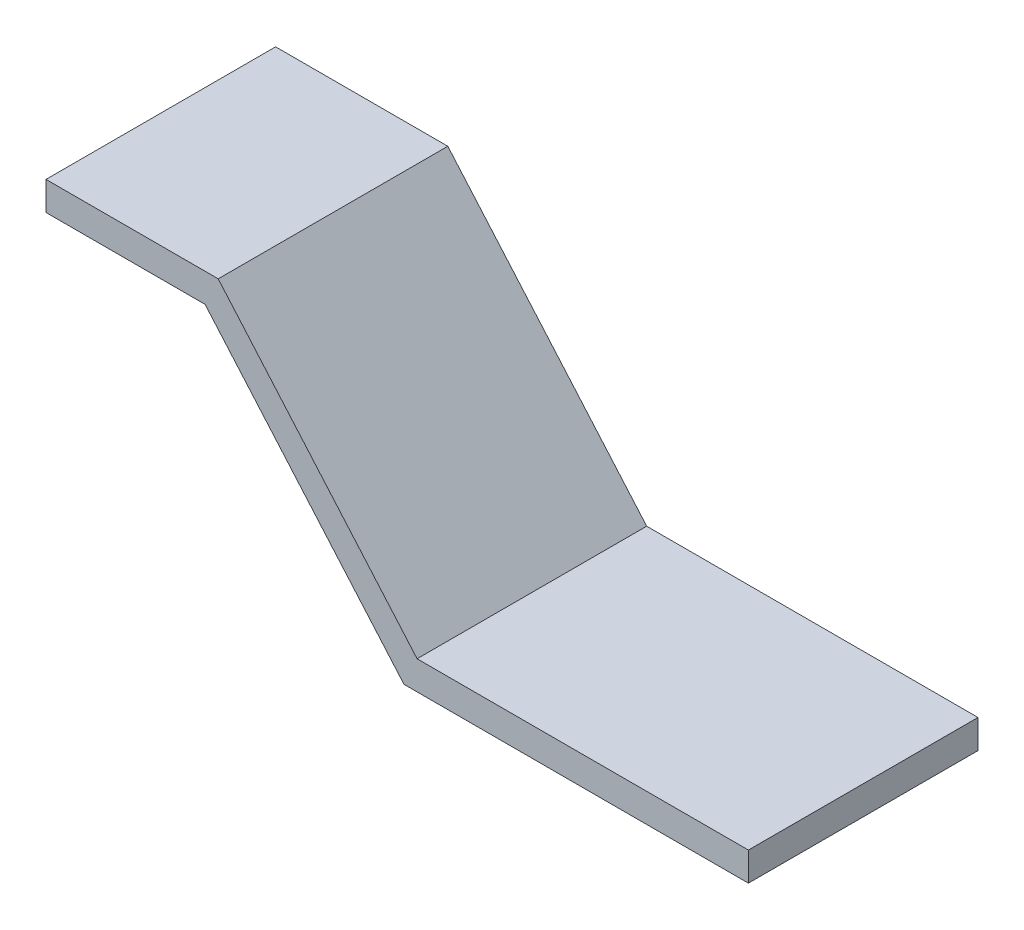
ISO-10303-21;
HEADER;
FILE_DESCRIPTION(('STEP AP214'),'2;1');
FILE_NAME('part.step','',(''),(''),'','','');
FILE_SCHEMA(('AUTOMOTIVE_DESIGN { 1 0 10303 214 1 1 1 1 }'));
ENDSEC;
DATA;
#1=APPLICATION_CONTEXT('core data for automotive mechanical design processes');
#2=APPLICATION_PROTOCOL_DEFINITION('international standard','automotive_design',2000,#1);
#3=PRODUCT_CONTEXT('',#1,'mechanical');
#4=PRODUCT('Part','Part','',(#3));
#5=PRODUCT_RELATED_PRODUCT_CATEGORY('part','',(#4));
#6=PRODUCT_DEFINITION_FORMATION('','',#4);
#7=PRODUCT_DEFINITION_CONTEXT('part definition',#1,'design');
#8=PRODUCT_DEFINITION('design','',#6,#7);
#9=PRODUCT_DEFINITION_SHAPE('','',#8);
#10=(LENGTH_UNIT() NAMED_UNIT(*) SI_UNIT(.MILLI.,.METRE.));
#11=(NAMED_UNIT(*) PLANE_ANGLE_UNIT() SI_UNIT($,.RADIAN.));
#12=(NAMED_UNIT(*) SI_UNIT($,.STERADIAN.) SOLID_ANGLE_UNIT());
#13=UNCERTAINTY_MEASURE_WITH_UNIT(LENGTH_MEASURE(1.E-05),#10,'distance_accuracy_value','');
#14=(GEOMETRIC_REPRESENTATION_CONTEXT(3) GLOBAL_UNCERTAINTY_ASSIGNED_CONTEXT((#13)) GLOBAL_UNIT_ASSIGNED_CONTEXT((#10,
#11,#12)) REPRESENTATION_CONTEXT('',''));
#15=CARTESIAN_POINT('',(0.,0.,0.));
#16=DIRECTION('',(0.,0.,1.));
#17=DIRECTION('',(1.,0.,0.));
#18=AXIS2_PLACEMENT_3D('',#15,#16,#17);
#19=CARTESIAN_POINT('',(0.,-25.,200.));
#20=DIRECTION('',(1.,0.,0.));
#21=DIRECTION('',(0.,0.,-1.));
#22=AXIS2_PLACEMENT_3D('',#19,#20,#21);
#23=PLANE('',#22);
#24=DIRECTION('',(0.,-1.,0.));
#25=VECTOR('',#24,1.);
#26=CARTESIAN_POINT('',(0.,-25.,0.));
#27=LINE('',#26,#25);
#28=CARTESIAN_POINT('',(0.,0.,0.));
#29=VERTEX_POINT('',#28);
#30=CARTESIAN_POINT('',(0.,-25.,0.));
#31=VERTEX_POINT('',#30);
#32=EDGE_CURVE('E134',#29,#31,#27,.T.);
#33=ORIENTED_EDGE('',*,*,#32,.T.);
#34=DIRECTION('',(0.,0.,-1.));
#35=VECTOR('',#34,1.);
#36=CARTESIAN_POINT('',(0.,-25.,200.));
#37=LINE('',#36,#35);
#38=CARTESIAN_POINT('',(0.,-25.,200.));
#39=VERTEX_POINT('',#38);
#40=EDGE_CURVE('E11',#39,#31,#37,.T.);
#41=ORIENTED_EDGE('',*,*,#40,.F.);
#42=DIRECTION('',(0.,-1.,0.));
#43=VECTOR('',#42,1.);
#44=CARTESIAN_POINT('',(0.,-25.,200.));
#45=LINE('',#44,#43);
#46=CARTESIAN_POINT('',(0.,0.,200.));
#47=VERTEX_POINT('',#46);
#48=EDGE_CURVE('E148',#47,#39,#45,.T.);
#49=ORIENTED_EDGE('',*,*,#48,.F.);
#50=DIRECTION('',(0.,0.,-1.));
#51=VECTOR('',#50,1.);
#52=CARTESIAN_POINT('',(0.,0.,200.));
#53=LINE('',#52,#51);
#54=EDGE_CURVE('E130',#47,#29,#53,.T.);
#55=ORIENTED_EDGE('',*,*,#54,.T.);
#56=EDGE_LOOP('',(#33,#41,#49,#55));
#57=FACE_BOUND('',#56,.T.);
#58=ADVANCED_FACE('F38',(#57),#23,.F.);
#59=CARTESIAN_POINT('',(138.579470789116,-25.,200.));
#60=DIRECTION('',(0.,1.,0.));
#61=DIRECTION('',(-1.,0.,0.));
#62=AXIS2_PLACEMENT_3D('',#59,#60,#61);
#63=PLANE('',#62);
#64=DIRECTION('',(1.,0.,0.));
#65=VECTOR('',#64,1.);
#66=CARTESIAN_POINT('',(138.579470789116,-25.,0.));
#67=LINE('',#66,#65);
#68=CARTESIAN_POINT('',(138.579470789116,-25.,0.));
#69=VERTEX_POINT('',#68);
#70=EDGE_CURVE('E137',#31,#69,#67,.T.);
#71=ORIENTED_EDGE('',*,*,#70,.T.);
#72=DIRECTION('',(0.,0.,-1.));
#73=VECTOR('',#72,1.);
#74=CARTESIAN_POINT('',(138.579470789116,-25.,200.));
#75=LINE('',#74,#73);
#76=CARTESIAN_POINT('',(138.579470789116,-25.,200.));
#77=VERTEX_POINT('',#76);
#78=EDGE_CURVE('E46',#77,#69,#75,.T.);
#79=ORIENTED_EDGE('',*,*,#78,.F.);
#80=DIRECTION('',(1.,0.,0.));
#81=VECTOR('',#80,1.);
#82=CARTESIAN_POINT('',(138.579470789116,-25.,200.));
#83=LINE('',#82,#81);
#84=EDGE_CURVE('E97',#39,#77,#83,.T.);
#85=ORIENTED_EDGE('',*,*,#84,.F.);
#86=ORIENTED_EDGE('',*,*,#40,.T.);
#87=EDGE_LOOP('',(#71,#79,#85,#86));
#88=FACE_BOUND('',#87,.T.);
#89=ADVANCED_FACE('F183',(#88),#63,.F.);
#90=CARTESIAN_POINT('',(311.801395416564,-225.,200.));
#91=DIRECTION('',(0.755897441022797,0.654690047774661,0.));
#92=DIRECTION('',(-0.654690047774661,0.755897441022797,0.));
#93=AXIS2_PLACEMENT_3D('',#90,#91,#92);
#94=PLANE('',#93);
#95=DIRECTION('',(0.654690047774661,-0.755897441022797,0.));
#96=VECTOR('',#95,1.);
#97=CARTESIAN_POINT('',(311.801395416564,-225.,0.));
#98=LINE('',#97,#96);
#99=CARTESIAN_POINT('',(311.801395416564,-225.,0.));
#100=VERTEX_POINT('',#99);
#101=EDGE_CURVE('E139',#69,#100,#98,.T.);
#102=ORIENTED_EDGE('',*,*,#101,.T.);
#103=DIRECTION('',(0.,0.,-1.));
#104=VECTOR('',#103,1.);
#105=CARTESIAN_POINT('',(311.801395416564,-225.,200.));
#106=LINE('',#105,#104);
#107=CARTESIAN_POINT('',(311.801395416564,-225.,200.));
#108=VERTEX_POINT('',#107);
#109=EDGE_CURVE('E155',#108,#100,#106,.T.);
#110=ORIENTED_EDGE('',*,*,#109,.F.);
#111=DIRECTION('',(0.654690047774661,-0.755897441022797,0.));
#112=VECTOR('',#111,1.);
#113=CARTESIAN_POINT('',(311.801395416564,-225.,200.));
#114=LINE('',#113,#112);
#115=EDGE_CURVE('E163',#77,#108,#114,.T.);
#116=ORIENTED_EDGE('',*,*,#115,.F.);
#117=ORIENTED_EDGE('',*,*,#78,.T.);
#118=EDGE_LOOP('',(#102,#110,#116,#117));
#119=FACE_BOUND('',#118,.T.);
#120=ADVANCED_FACE('F161',(#119),#94,.F.);
#121=CARTESIAN_POINT('',(611.801395416564,-225.,200.));
#122=DIRECTION('',(0.,1.,0.));
#123=DIRECTION('',(0.,0.,1.));
#124=AXIS2_PLACEMENT_3D('',#121,#122,#123);
#125=PLANE('',#124);
#126=DIRECTION('',(1.,0.,0.));
#127=VECTOR('',#126,1.);
#128=CARTESIAN_POINT('',(611.801395416564,-225.,0.));
#129=LINE('',#128,#127);
#130=CARTESIAN_POINT('',(611.801395416564,-225.,0.));
#131=VERTEX_POINT('',#130);
#132=EDGE_CURVE('E141',#100,#131,#129,.T.);
#133=ORIENTED_EDGE('',*,*,#132,.T.);
#134=DIRECTION('',(0.,0.,-1.));
#135=VECTOR('',#134,1.);
#136=CARTESIAN_POINT('',(611.801395416564,-225.,200.));
#137=LINE('',#136,#135);
#138=CARTESIAN_POINT('',(611.801395416564,-225.,200.));
#139=VERTEX_POINT('',#138);
#140=EDGE_CURVE('E152',#139,#131,#137,.T.);
#141=ORIENTED_EDGE('',*,*,#140,.F.);
#142=DIRECTION('',(1.,0.,0.));
#143=VECTOR('',#142,1.);
#144=CARTESIAN_POINT('',(611.801395416564,-225.,200.));
#145=LINE('',#144,#143);
#146=EDGE_CURVE('E175',#108,#139,#145,.T.);
#147=ORIENTED_EDGE('',*,*,#146,.F.);
#148=ORIENTED_EDGE('',*,*,#109,.T.);
#149=EDGE_LOOP('',(#133,#141,#147,#148));
#150=FACE_BOUND('',#149,.T.);
#151=ADVANCED_FACE('F171',(#150),#125,.F.);
#152=CARTESIAN_POINT('',(611.801395416564,-200.,200.));
#153=DIRECTION('',(-1.,0.,0.));
#154=DIRECTION('',(0.,0.,1.));
#155=AXIS2_PLACEMENT_3D('',#152,#153,#154);
#156=PLANE('',#155);
#157=DIRECTION('',(0.,1.,0.));
#158=VECTOR('',#157,1.);
#159=CARTESIAN_POINT('',(611.801395416564,-200.,0.));
#160=LINE('',#159,#158);
#161=CARTESIAN_POINT('',(611.801395416564,-200.,0.));
#162=VERTEX_POINT('',#161);
#163=EDGE_CURVE('E143',#131,#162,#160,.T.);
#164=ORIENTED_EDGE('',*,*,#163,.T.);
#165=DIRECTION('',(0.,0.,-1.));
#166=VECTOR('',#165,1.);
#167=CARTESIAN_POINT('',(611.801395416564,-200.,200.));
#168=LINE('',#167,#166);
#169=CARTESIAN_POINT('',(611.801395416564,-200.,200.));
#170=VERTEX_POINT('',#169);
#171=EDGE_CURVE('E125',#170,#162,#168,.T.);
#172=ORIENTED_EDGE('',*,*,#171,.F.);
#173=DIRECTION('',(0.,1.,0.));
#174=VECTOR('',#173,1.);
#175=CARTESIAN_POINT('',(611.801395416564,-200.,200.));
#176=LINE('',#175,#174);
#177=EDGE_CURVE('E116',#139,#170,#176,.T.);
#178=ORIENTED_EDGE('',*,*,#177,.F.);
#179=ORIENTED_EDGE('',*,*,#140,.T.);
#180=EDGE_LOOP('',(#164,#172,#178,#179));
#181=FACE_BOUND('',#180,.T.);
#182=ADVANCED_FACE('F174',(#181),#156,.F.);
#183=CARTESIAN_POINT('',(323.221924627448,-200.,200.));
#184=DIRECTION('',(0.,-1.,0.));
#185=DIRECTION('',(0.,0.,-1.));
#186=AXIS2_PLACEMENT_3D('',#183,#184,#185);
#187=PLANE('',#186);
#188=DIRECTION('',(-1.,0.,0.));
#189=VECTOR('',#188,1.);
#190=CARTESIAN_POINT('',(323.221924627448,-200.,0.));
#191=LINE('',#190,#189);
#192=CARTESIAN_POINT('',(323.221924627448,-200.,0.));
#193=VERTEX_POINT('',#192);
#194=EDGE_CURVE('E124',#162,#193,#191,.T.);
#195=ORIENTED_EDGE('',*,*,#194,.T.);
#196=DIRECTION('',(0.,0.,-1.));
#197=VECTOR('',#196,1.);
#198=CARTESIAN_POINT('',(323.221924627448,-200.,200.));
#199=LINE('',#198,#197);
#200=CARTESIAN_POINT('',(323.221924627448,-200.,200.));
#201=VERTEX_POINT('',#200);
#202=EDGE_CURVE('E121',#201,#193,#199,.T.);
#203=ORIENTED_EDGE('',*,*,#202,.F.);
#204=DIRECTION('',(-1.,0.,0.));
#205=VECTOR('',#204,1.);
#206=CARTESIAN_POINT('',(323.221924627448,-200.,200.));
#207=LINE('',#206,#205);
#208=EDGE_CURVE('E110',#170,#201,#207,.T.);
#209=ORIENTED_EDGE('',*,*,#208,.F.);
#210=ORIENTED_EDGE('',*,*,#171,.T.);
#211=EDGE_LOOP('',(#195,#203,#209,#210));
#212=FACE_BOUND('',#211,.T.);
#213=ADVANCED_FACE('F122',(#212),#187,.F.);
#214=CARTESIAN_POINT('',(150.,0.,200.));
#215=DIRECTION('',(-0.755897441022797,-0.654690047774661,0.));
#216=DIRECTION('',(0.654690047774661,-0.755897441022797,0.));
#217=AXIS2_PLACEMENT_3D('',#214,#215,#216);
#218=PLANE('',#217);
#219=DIRECTION('',(-0.654690047774661,0.755897441022797,0.));
#220=VECTOR('',#219,1.);
#221=CARTESIAN_POINT('',(150.,0.,0.));
#222=LINE('',#221,#220);
#223=CARTESIAN_POINT('',(150.,0.,0.));
#224=VERTEX_POINT('',#223);
#225=EDGE_CURVE('E83',#193,#224,#222,.T.);
#226=ORIENTED_EDGE('',*,*,#225,.T.);
#227=DIRECTION('',(0.,0.,-1.));
#228=VECTOR('',#227,1.);
#229=CARTESIAN_POINT('',(150.,0.,200.));
#230=LINE('',#229,#228);
#231=CARTESIAN_POINT('',(150.,0.,200.));
#232=VERTEX_POINT('',#231);
#233=EDGE_CURVE('E126',#232,#224,#230,.T.);
#234=ORIENTED_EDGE('',*,*,#233,.F.);
#235=DIRECTION('',(-0.654690047774661,0.755897441022797,0.));
#236=VECTOR('',#235,1.);
#237=CARTESIAN_POINT('',(150.,0.,200.));
#238=LINE('',#237,#236);
#239=EDGE_CURVE('E114',#201,#232,#238,.T.);
#240=ORIENTED_EDGE('',*,*,#239,.F.);
#241=ORIENTED_EDGE('',*,*,#202,.T.);
#242=EDGE_LOOP('',(#226,#234,#240,#241));
#243=FACE_BOUND('',#242,.T.);
#244=ADVANCED_FACE('F128',(#243),#218,.F.);
#245=CARTESIAN_POINT('',(0.,0.,200.));
#246=DIRECTION('',(0.,-1.,0.));
#247=DIRECTION('',(0.,0.,-1.));
#248=AXIS2_PLACEMENT_3D('',#245,#246,#247);
#249=PLANE('',#248);
#250=DIRECTION('',(-1.,0.,0.));
#251=VECTOR('',#250,1.);
#252=CARTESIAN_POINT('',(0.,0.,0.));
#253=LINE('',#252,#251);
#254=EDGE_CURVE('E89',#224,#29,#253,.T.);
#255=ORIENTED_EDGE('',*,*,#254,.T.);
#256=ORIENTED_EDGE('',*,*,#54,.F.);
#257=DIRECTION('',(-1.,0.,0.));
#258=VECTOR('',#257,1.);
#259=CARTESIAN_POINT('',(0.,0.,200.));
#260=LINE('',#259,#258);
#261=EDGE_CURVE('E54',#232,#47,#260,.T.);
#262=ORIENTED_EDGE('',*,*,#261,.F.);
#263=ORIENTED_EDGE('',*,*,#233,.T.);
#264=EDGE_LOOP('',(#255,#256,#262,#263));
#265=FACE_BOUND('',#264,.T.);
#266=ADVANCED_FACE('F199',(#265),#249,.F.);
#267=CARTESIAN_POINT('',(0.,0.,200.));
#268=DIRECTION('',(0.,0.,-1.));
#269=DIRECTION('',(-1.,0.,0.));
#270=AXIS2_PLACEMENT_3D('',#267,#268,#269);
#271=PLANE('',#270);
#272=ORIENTED_EDGE('',*,*,#48,.T.);
#273=ORIENTED_EDGE('',*,*,#84,.T.);
#274=ORIENTED_EDGE('',*,*,#115,.T.);
#275=ORIENTED_EDGE('',*,*,#146,.T.);
#276=ORIENTED_EDGE('',*,*,#177,.T.);
#277=ORIENTED_EDGE('',*,*,#208,.T.);
#278=ORIENTED_EDGE('',*,*,#239,.T.);
#279=ORIENTED_EDGE('',*,*,#261,.T.);
#280=EDGE_LOOP('',(#272,#273,#274,#275,#276,#277,#278,#279));
#281=FACE_BOUND('',#280,.T.);
#282=ADVANCED_FACE('F112',(#281),#271,.F.);
#283=CARTESIAN_POINT('',(0.,0.,0.));
#284=DIRECTION('',(0.,0.,-1.));
#285=DIRECTION('',(-1.,0.,0.));
#286=AXIS2_PLACEMENT_3D('',#283,#284,#285);
#287=PLANE('',#286);
#288=ORIENTED_EDGE('',*,*,#32,.F.);
#289=ORIENTED_EDGE('',*,*,#254,.F.);
#290=ORIENTED_EDGE('',*,*,#225,.F.);
#291=ORIENTED_EDGE('',*,*,#194,.F.);
#292=ORIENTED_EDGE('',*,*,#163,.F.);
#293=ORIENTED_EDGE('',*,*,#132,.F.);
#294=ORIENTED_EDGE('',*,*,#101,.F.);
#295=ORIENTED_EDGE('',*,*,#70,.F.);
#296=EDGE_LOOP('',(#288,#289,#290,#291,#292,#293,#294,#295));
#297=FACE_BOUND('',#296,.T.);
#298=ADVANCED_FACE('F167',(#297),#287,.T.);
#299=CLOSED_SHELL('',(#58,#89,#120,#151,#182,#213,#244,#266,#282,#298));
#300=MANIFOLD_SOLID_BREP('B2',#299);
#301=ADVANCED_BREP_SHAPE_REPRESENTATION('',(#18,#300),#14);
#302=SHAPE_DEFINITION_REPRESENTATION(#9,#301);
ENDSEC;
END-ISO-10303-21;
